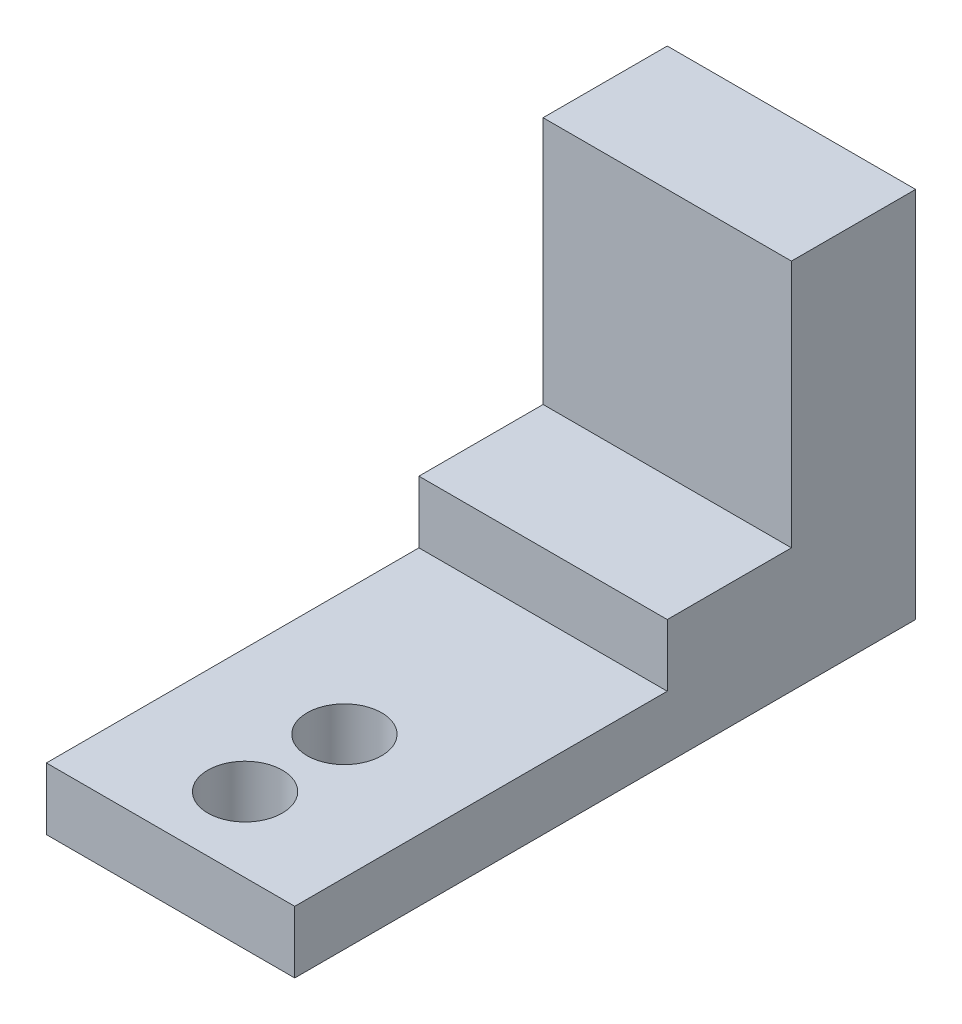
ISO-10303-21;
HEADER;
FILE_DESCRIPTION(('STEP AP214'),'2;1');
FILE_NAME('part.step','',(''),(''),'','','');
FILE_SCHEMA(('AUTOMOTIVE_DESIGN { 1 0 10303 214 1 1 1 1 }'));
ENDSEC;
DATA;
#1=APPLICATION_CONTEXT('core data for automotive mechanical design processes');
#2=APPLICATION_PROTOCOL_DEFINITION('international standard','automotive_design',2000,#1);
#3=PRODUCT_CONTEXT('',#1,'mechanical');
#4=PRODUCT('Part','Part','',(#3));
#5=PRODUCT_RELATED_PRODUCT_CATEGORY('part','',(#4));
#6=PRODUCT_DEFINITION_FORMATION('','',#4);
#7=PRODUCT_DEFINITION_CONTEXT('part definition',#1,'design');
#8=PRODUCT_DEFINITION('design','',#6,#7);
#9=PRODUCT_DEFINITION_SHAPE('','',#8);
#10=(LENGTH_UNIT() NAMED_UNIT(*) SI_UNIT(.MILLI.,.METRE.));
#11=(NAMED_UNIT(*) PLANE_ANGLE_UNIT() SI_UNIT($,.RADIAN.));
#12=(NAMED_UNIT(*) SI_UNIT($,.STERADIAN.) SOLID_ANGLE_UNIT());
#13=UNCERTAINTY_MEASURE_WITH_UNIT(LENGTH_MEASURE(1.E-05),#10,'distance_accuracy_value','');
#14=(GEOMETRIC_REPRESENTATION_CONTEXT(3) GLOBAL_UNCERTAINTY_ASSIGNED_CONTEXT((#13)) GLOBAL_UNIT_ASSIGNED_CONTEXT((#10,
#11,#12)) REPRESENTATION_CONTEXT('',''));
#15=CARTESIAN_POINT('',(0.,0.,0.));
#16=DIRECTION('',(0.,0.,1.));
#17=DIRECTION('',(1.,0.,0.));
#18=AXIS2_PLACEMENT_3D('',#15,#16,#17);
#19=CARTESIAN_POINT('',(10.,2.5,-10.));
#20=DIRECTION('',(0.,-1.,0.));
#21=DIRECTION('',(0.,0.,-1.));
#22=AXIS2_PLACEMENT_3D('',#19,#20,#21);
#23=PLANE('',#22);
#24=DIRECTION('',(1.,0.,0.));
#25=VECTOR('',#24,1.);
#26=CARTESIAN_POINT('',(0.,2.5,-5.));
#27=LINE('',#26,#25);
#28=CARTESIAN_POINT('',(0.,2.5,-5.));
#29=VERTEX_POINT('',#28);
#30=CARTESIAN_POINT('',(10.,2.5,-5.));
#31=VERTEX_POINT('',#30);
#32=EDGE_CURVE('E54',#29,#31,#27,.T.);
#33=ORIENTED_EDGE('',*,*,#32,.F.);
#34=DIRECTION('',(0.,0.,1.));
#35=VECTOR('',#34,1.);
#36=CARTESIAN_POINT('',(0.,2.5,-10.));
#37=LINE('',#36,#35);
#38=CARTESIAN_POINT('',(0.,2.5,0.));
#39=VERTEX_POINT('',#38);
#40=EDGE_CURVE('E136',#29,#39,#37,.T.);
#41=ORIENTED_EDGE('',*,*,#40,.T.);
#42=DIRECTION('',(1.,0.,0.));
#43=VECTOR('',#42,1.);
#44=CARTESIAN_POINT('',(10.,2.5,0.));
#45=LINE('',#44,#43);
#46=CARTESIAN_POINT('',(10.,2.5,0.));
#47=VERTEX_POINT('',#46);
#48=EDGE_CURVE('E144',#39,#47,#45,.T.);
#49=ORIENTED_EDGE('',*,*,#48,.T.);
#50=DIRECTION('',(0.,0.,1.));
#51=VECTOR('',#50,1.);
#52=CARTESIAN_POINT('',(10.,2.5,-10.));
#53=LINE('',#52,#51);
#54=EDGE_CURVE('E140',#31,#47,#53,.T.);
#55=ORIENTED_EDGE('',*,*,#54,.F.);
#56=EDGE_LOOP('',(#33,#41,#49,#55));
#57=FACE_BOUND('',#56,.T.);
#58=ADVANCED_FACE('F39',(#57),#23,.F.);
#59=CARTESIAN_POINT('',(0.,0.,15.));
#60=DIRECTION('',(1.,0.,0.));
#61=DIRECTION('',(0.,0.,-1.));
#62=AXIS2_PLACEMENT_3D('',#59,#60,#61);
#63=PLANE('',#62);
#64=DIRECTION('',(0.,0.,-1.));
#65=VECTOR('',#64,1.);
#66=CARTESIAN_POINT('',(0.,0.,15.));
#67=LINE('',#66,#65);
#68=CARTESIAN_POINT('',(0.,0.,15.));
#69=VERTEX_POINT('',#68);
#70=CARTESIAN_POINT('',(0.,0.,0.));
#71=VERTEX_POINT('',#70);
#72=EDGE_CURVE('E114',#69,#71,#67,.T.);
#73=ORIENTED_EDGE('',*,*,#72,.T.);
#74=DIRECTION('',(0.,1.,0.));
#75=VECTOR('',#74,1.);
#76=CARTESIAN_POINT('',(0.,-2.5,0.));
#77=LINE('',#76,#75);
#78=EDGE_CURVE('E76',#71,#39,#77,.T.);
#79=ORIENTED_EDGE('',*,*,#78,.T.);
#80=ORIENTED_EDGE('',*,*,#40,.F.);
#81=DIRECTION('',(0.,-1.,0.));
#82=VECTOR('',#81,1.);
#83=CARTESIAN_POINT('',(0.,12.5,-5.));
#84=LINE('',#83,#82);
#85=CARTESIAN_POINT('',(0.,12.5,-5.));
#86=VERTEX_POINT('',#85);
#87=EDGE_CURVE('E151',#86,#29,#84,.T.);
#88=ORIENTED_EDGE('',*,*,#87,.F.);
#89=DIRECTION('',(0.,0.,1.));
#90=VECTOR('',#89,1.);
#91=CARTESIAN_POINT('',(0.,12.5,-10.));
#92=LINE('',#91,#90);
#93=CARTESIAN_POINT('',(0.,12.5,-10.));
#94=VERTEX_POINT('',#93);
#95=EDGE_CURVE('E163',#94,#86,#92,.T.);
#96=ORIENTED_EDGE('',*,*,#95,.F.);
#97=DIRECTION('',(0.,1.,0.));
#98=VECTOR('',#97,1.);
#99=CARTESIAN_POINT('',(0.,-2.5,-10.));
#100=LINE('',#99,#98);
#101=CARTESIAN_POINT('',(0.,-2.5,-10.));
#102=VERTEX_POINT('',#101);
#103=EDGE_CURVE('E143',#102,#94,#100,.T.);
#104=ORIENTED_EDGE('',*,*,#103,.F.);
#105=DIRECTION('',(0.,0.,-1.));
#106=VECTOR('',#105,1.);
#107=CARTESIAN_POINT('',(0.,-2.5,15.));
#108=LINE('',#107,#106);
#109=CARTESIAN_POINT('',(0.,-2.5,15.));
#110=VERTEX_POINT('',#109);
#111=EDGE_CURVE('E11',#110,#102,#108,.T.);
#112=ORIENTED_EDGE('',*,*,#111,.F.);
#113=DIRECTION('',(0.,-1.,0.));
#114=VECTOR('',#113,1.);
#115=CARTESIAN_POINT('',(0.,0.,15.));
#116=LINE('',#115,#114);
#117=EDGE_CURVE('E98',#69,#110,#116,.T.);
#118=ORIENTED_EDGE('',*,*,#117,.F.);
#119=EDGE_LOOP('',(#73,#79,#80,#88,#96,#104,#112,#118));
#120=FACE_BOUND('',#119,.T.);
#121=ADVANCED_FACE('F41',(#120),#63,.F.);
#122=CARTESIAN_POINT('',(0.,-2.5,15.));
#123=DIRECTION('',(0.,1.,0.));
#124=DIRECTION('',(0.,0.,1.));
#125=AXIS2_PLACEMENT_3D('',#122,#123,#124);
#126=PLANE('',#125);
#127=CARTESIAN_POINT('',(5.,-2.5,12.));
#128=DIRECTION('',(0.,1.,0.));
#129=DIRECTION('',(0.,0.,1.));
#130=AXIS2_PLACEMENT_3D('',#127,#128,#129);
#131=CIRCLE('',#130,1.5);
#132=CARTESIAN_POINT('',(5.,-2.5,13.5));
#133=VERTEX_POINT('',#132);
#134=EDGE_CURVE('E119',#133,#133,#131,.T.);
#135=ORIENTED_EDGE('',*,*,#134,.T.);
#136=EDGE_LOOP('',(#135));
#137=FACE_BOUND('',#136,.T.);
#138=CARTESIAN_POINT('',(5.,-2.5,8.));
#139=DIRECTION('',(0.,1.,0.));
#140=DIRECTION('',(0.,0.,1.));
#141=AXIS2_PLACEMENT_3D('',#138,#139,#140);
#142=CIRCLE('',#141,1.5);
#143=CARTESIAN_POINT('',(5.,-2.5,9.5));
#144=VERTEX_POINT('',#143);
#145=EDGE_CURVE('E129',#144,#144,#142,.T.);
#146=ORIENTED_EDGE('',*,*,#145,.T.);
#147=EDGE_LOOP('',(#146));
#148=FACE_BOUND('',#147,.T.);
#149=ORIENTED_EDGE('',*,*,#111,.T.);
#150=DIRECTION('',(-1.,0.,0.));
#151=VECTOR('',#150,1.);
#152=CARTESIAN_POINT('',(10.,-2.5,-10.));
#153=LINE('',#152,#151);
#154=CARTESIAN_POINT('',(10.,-2.5,-10.));
#155=VERTEX_POINT('',#154);
#156=EDGE_CURVE('E106',#155,#102,#153,.T.);
#157=ORIENTED_EDGE('',*,*,#156,.F.);
#158=DIRECTION('',(0.,0.,-1.));
#159=VECTOR('',#158,1.);
#160=CARTESIAN_POINT('',(10.,-2.5,15.));
#161=LINE('',#160,#159);
#162=CARTESIAN_POINT('',(10.,-2.5,15.));
#163=VERTEX_POINT('',#162);
#164=EDGE_CURVE('E47',#163,#155,#161,.T.);
#165=ORIENTED_EDGE('',*,*,#164,.F.);
#166=DIRECTION('',(1.,0.,0.));
#167=VECTOR('',#166,1.);
#168=CARTESIAN_POINT('',(0.,-2.5,15.));
#169=LINE('',#168,#167);
#170=EDGE_CURVE('E91',#110,#163,#169,.T.);
#171=ORIENTED_EDGE('',*,*,#170,.F.);
#172=EDGE_LOOP('',(#149,#157,#165,#171));
#173=FACE_BOUND('',#172,.T.);
#174=ADVANCED_FACE('F104',(#137,#148,#173),#126,.F.);
#175=CARTESIAN_POINT('',(10.,0.,15.));
#176=DIRECTION('',(-1.,0.,0.));
#177=DIRECTION('',(0.,0.,1.));
#178=AXIS2_PLACEMENT_3D('',#175,#176,#177);
#179=PLANE('',#178);
#180=ORIENTED_EDGE('',*,*,#164,.T.);
#181=DIRECTION('',(0.,-1.,0.));
#182=VECTOR('',#181,1.);
#183=CARTESIAN_POINT('',(10.,-2.5,-10.));
#184=LINE('',#183,#182);
#185=CARTESIAN_POINT('',(10.,12.5,-10.));
#186=VERTEX_POINT('',#185);
#187=EDGE_CURVE('E147',#186,#155,#184,.T.);
#188=ORIENTED_EDGE('',*,*,#187,.F.);
#189=DIRECTION('',(0.,0.,-1.));
#190=VECTOR('',#189,1.);
#191=CARTESIAN_POINT('',(10.,12.5,-10.));
#192=LINE('',#191,#190);
#193=CARTESIAN_POINT('',(10.,12.5,-5.));
#194=VERTEX_POINT('',#193);
#195=EDGE_CURVE('E166',#194,#186,#192,.T.);
#196=ORIENTED_EDGE('',*,*,#195,.F.);
#197=DIRECTION('',(0.,-1.,0.));
#198=VECTOR('',#197,1.);
#199=CARTESIAN_POINT('',(10.,12.5,-5.));
#200=LINE('',#199,#198);
#201=EDGE_CURVE('E158',#194,#31,#200,.T.);
#202=ORIENTED_EDGE('',*,*,#201,.T.);
#203=ORIENTED_EDGE('',*,*,#54,.T.);
#204=DIRECTION('',(0.,-1.,0.));
#205=VECTOR('',#204,1.);
#206=CARTESIAN_POINT('',(10.,-2.5,0.));
#207=LINE('',#206,#205);
#208=CARTESIAN_POINT('',(10.,0.,0.));
#209=VERTEX_POINT('',#208);
#210=EDGE_CURVE('E149',#47,#209,#207,.T.);
#211=ORIENTED_EDGE('',*,*,#210,.T.);
#212=DIRECTION('',(0.,0.,-1.));
#213=VECTOR('',#212,1.);
#214=CARTESIAN_POINT('',(10.,0.,15.));
#215=LINE('',#214,#213);
#216=CARTESIAN_POINT('',(10.,0.,15.));
#217=VERTEX_POINT('',#216);
#218=EDGE_CURVE('E110',#217,#209,#215,.T.);
#219=ORIENTED_EDGE('',*,*,#218,.F.);
#220=DIRECTION('',(0.,1.,0.));
#221=VECTOR('',#220,1.);
#222=CARTESIAN_POINT('',(10.,0.,15.));
#223=LINE('',#222,#221);
#224=EDGE_CURVE('E95',#163,#217,#223,.T.);
#225=ORIENTED_EDGE('',*,*,#224,.F.);
#226=EDGE_LOOP('',(#180,#188,#196,#202,#203,#211,#219,#225));
#227=FACE_BOUND('',#226,.T.);
#228=ADVANCED_FACE('F111',(#227),#179,.F.);
#229=CARTESIAN_POINT('',(0.,0.,15.));
#230=DIRECTION('',(0.,-1.,0.));
#231=DIRECTION('',(0.,0.,-1.));
#232=AXIS2_PLACEMENT_3D('',#229,#230,#231);
#233=PLANE('',#232);
#234=CARTESIAN_POINT('',(5.,0.,12.));
#235=DIRECTION('',(0.,1.,0.));
#236=DIRECTION('',(0.,0.,1.));
#237=AXIS2_PLACEMENT_3D('',#234,#235,#236);
#238=CIRCLE('',#237,1.5);
#239=CARTESIAN_POINT('',(5.,0.,13.5));
#240=VERTEX_POINT('',#239);
#241=EDGE_CURVE('E132',#240,#240,#238,.T.);
#242=ORIENTED_EDGE('',*,*,#241,.F.);
#243=EDGE_LOOP('',(#242));
#244=FACE_BOUND('',#243,.T.);
#245=CARTESIAN_POINT('',(5.,0.,8.));
#246=DIRECTION('',(0.,1.,0.));
#247=DIRECTION('',(0.,0.,1.));
#248=AXIS2_PLACEMENT_3D('',#245,#246,#247);
#249=CIRCLE('',#248,1.5);
#250=CARTESIAN_POINT('',(5.,0.,9.5));
#251=VERTEX_POINT('',#250);
#252=EDGE_CURVE('E133',#251,#251,#249,.T.);
#253=ORIENTED_EDGE('',*,*,#252,.F.);
#254=EDGE_LOOP('',(#253));
#255=FACE_BOUND('',#254,.T.);
#256=DIRECTION('',(-1.,0.,0.));
#257=VECTOR('',#256,1.);
#258=CARTESIAN_POINT('',(0.,0.,0.));
#259=LINE('',#258,#257);
#260=EDGE_CURVE('E83',#209,#71,#259,.T.);
#261=ORIENTED_EDGE('',*,*,#260,.T.);
#262=ORIENTED_EDGE('',*,*,#72,.F.);
#263=DIRECTION('',(-1.,0.,0.));
#264=VECTOR('',#263,1.);
#265=CARTESIAN_POINT('',(0.,0.,15.));
#266=LINE('',#265,#264);
#267=EDGE_CURVE('E63',#217,#69,#266,.T.);
#268=ORIENTED_EDGE('',*,*,#267,.F.);
#269=ORIENTED_EDGE('',*,*,#218,.T.);
#270=EDGE_LOOP('',(#261,#262,#268,#269));
#271=FACE_BOUND('',#270,.T.);
#272=ADVANCED_FACE('F123',(#244,#255,#271),#233,.F.);
#273=CARTESIAN_POINT('',(0.,0.,15.));
#274=DIRECTION('',(0.,0.,1.));
#275=DIRECTION('',(1.,0.,0.));
#276=AXIS2_PLACEMENT_3D('',#273,#274,#275);
#277=PLANE('',#276);
#278=ORIENTED_EDGE('',*,*,#117,.T.);
#279=ORIENTED_EDGE('',*,*,#170,.T.);
#280=ORIENTED_EDGE('',*,*,#224,.T.);
#281=ORIENTED_EDGE('',*,*,#267,.T.);
#282=EDGE_LOOP('',(#278,#279,#280,#281));
#283=FACE_BOUND('',#282,.T.);
#284=ADVANCED_FACE('F93',(#283),#277,.T.);
#285=CARTESIAN_POINT('',(5.,-15.,8.));
#286=DIRECTION('',(0.,1.,0.));
#287=DIRECTION('',(0.,0.,1.));
#288=AXIS2_PLACEMENT_3D('',#285,#286,#287);
#289=CYLINDRICAL_SURFACE('',#288,1.5);
#290=ORIENTED_EDGE('',*,*,#252,.T.);
#291=EDGE_LOOP('',(#290));
#292=FACE_BOUND('',#291,.T.);
#293=ORIENTED_EDGE('',*,*,#145,.F.);
#294=EDGE_LOOP('',(#293));
#295=FACE_BOUND('',#294,.T.);
#296=ADVANCED_FACE('F208',(#292,#295),#289,.F.);
#297=CARTESIAN_POINT('',(5.,-15.,12.));
#298=DIRECTION('',(0.,1.,0.));
#299=DIRECTION('',(0.,0.,1.));
#300=AXIS2_PLACEMENT_3D('',#297,#298,#299);
#301=CYLINDRICAL_SURFACE('',#300,1.5);
#302=ORIENTED_EDGE('',*,*,#241,.T.);
#303=EDGE_LOOP('',(#302));
#304=FACE_BOUND('',#303,.T.);
#305=ORIENTED_EDGE('',*,*,#134,.F.);
#306=EDGE_LOOP('',(#305));
#307=FACE_BOUND('',#306,.T.);
#308=ADVANCED_FACE('F199',(#304,#307),#301,.F.);
#309=CARTESIAN_POINT('',(0.,0.,0.));
#310=DIRECTION('',(0.,0.,1.));
#311=DIRECTION('',(1.,0.,0.));
#312=AXIS2_PLACEMENT_3D('',#309,#310,#311);
#313=PLANE('',#312);
#314=ORIENTED_EDGE('',*,*,#260,.F.);
#315=ORIENTED_EDGE('',*,*,#210,.F.);
#316=ORIENTED_EDGE('',*,*,#48,.F.);
#317=ORIENTED_EDGE('',*,*,#78,.F.);
#318=EDGE_LOOP('',(#314,#315,#316,#317));
#319=FACE_BOUND('',#318,.T.);
#320=ADVANCED_FACE('F197',(#319),#313,.T.);
#321=CARTESIAN_POINT('',(0.,0.,-10.));
#322=DIRECTION('',(0.,0.,1.));
#323=DIRECTION('',(1.,0.,0.));
#324=AXIS2_PLACEMENT_3D('',#321,#322,#323);
#325=PLANE('',#324);
#326=ORIENTED_EDGE('',*,*,#187,.T.);
#327=ORIENTED_EDGE('',*,*,#156,.T.);
#328=ORIENTED_EDGE('',*,*,#103,.T.);
#329=DIRECTION('',(-1.,0.,0.));
#330=VECTOR('',#329,1.);
#331=CARTESIAN_POINT('',(0.,12.5,-10.));
#332=LINE('',#331,#330);
#333=EDGE_CURVE('E161',#186,#94,#332,.T.);
#334=ORIENTED_EDGE('',*,*,#333,.F.);
#335=EDGE_LOOP('',(#326,#327,#328,#334));
#336=FACE_BOUND('',#335,.T.);
#337=ADVANCED_FACE('F192',(#336),#325,.F.);
#338=CARTESIAN_POINT('',(0.,12.5,-5.));
#339=DIRECTION('',(0.,0.,-1.));
#340=DIRECTION('',(-1.,0.,0.));
#341=AXIS2_PLACEMENT_3D('',#338,#339,#340);
#342=PLANE('',#341);
#343=ORIENTED_EDGE('',*,*,#32,.T.);
#344=ORIENTED_EDGE('',*,*,#201,.F.);
#345=DIRECTION('',(1.,0.,0.));
#346=VECTOR('',#345,1.);
#347=CARTESIAN_POINT('',(0.,12.5,-5.));
#348=LINE('',#347,#346);
#349=EDGE_CURVE('E169',#86,#194,#348,.T.);
#350=ORIENTED_EDGE('',*,*,#349,.F.);
#351=ORIENTED_EDGE('',*,*,#87,.T.);
#352=EDGE_LOOP('',(#343,#344,#350,#351));
#353=FACE_BOUND('',#352,.T.);
#354=ADVANCED_FACE('F186',(#353),#342,.F.);
#355=CARTESIAN_POINT('',(0.,12.5,0.));
#356=DIRECTION('',(0.,1.,0.));
#357=DIRECTION('',(0.,0.,1.));
#358=AXIS2_PLACEMENT_3D('',#355,#356,#357);
#359=PLANE('',#358);
#360=ORIENTED_EDGE('',*,*,#95,.T.);
#361=ORIENTED_EDGE('',*,*,#349,.T.);
#362=ORIENTED_EDGE('',*,*,#195,.T.);
#363=ORIENTED_EDGE('',*,*,#333,.T.);
#364=EDGE_LOOP('',(#360,#361,#362,#363));
#365=FACE_BOUND('',#364,.T.);
#366=ADVANCED_FACE('F177',(#365),#359,.T.);
#367=CLOSED_SHELL('',(#58,#121,#174,#228,#272,#284,#296,#308,#320,#337,#354,#366));
#368=MANIFOLD_SOLID_BREP('B2',#367);
#369=ADVANCED_BREP_SHAPE_REPRESENTATION('',(#18,#368),#14);
#370=SHAPE_DEFINITION_REPRESENTATION(#9,#369);
ENDSEC;
END-ISO-10303-21;
